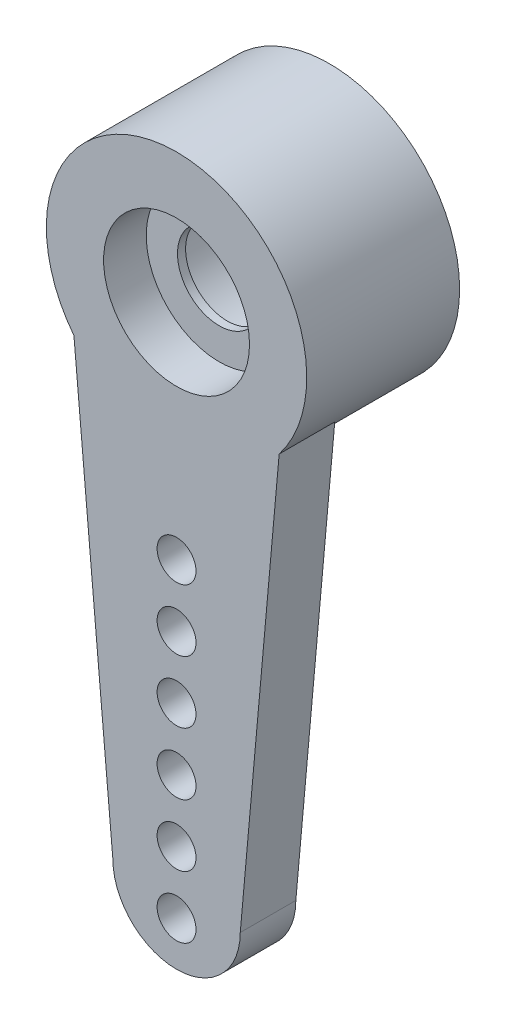
ISO-10303-21;
HEADER;
FILE_DESCRIPTION(('STEP AP214'),'2;1');
FILE_NAME('part.step','',(''),(''),'','','');
FILE_SCHEMA(('AUTOMOTIVE_DESIGN { 1 0 10303 214 1 1 1 1 }'));
ENDSEC;
DATA;
#1=APPLICATION_CONTEXT('core data for automotive mechanical design processes');
#2=APPLICATION_PROTOCOL_DEFINITION('international standard','automotive_design',2000,#1);
#3=PRODUCT_CONTEXT('',#1,'mechanical');
#4=PRODUCT('Part','Part','',(#3));
#5=PRODUCT_RELATED_PRODUCT_CATEGORY('part','',(#4));
#6=PRODUCT_DEFINITION_FORMATION('','',#4);
#7=PRODUCT_DEFINITION_CONTEXT('part definition',#1,'design');
#8=PRODUCT_DEFINITION('design','',#6,#7);
#9=PRODUCT_DEFINITION_SHAPE('','',#8);
#10=(LENGTH_UNIT() NAMED_UNIT(*) SI_UNIT(.MILLI.,.METRE.));
#11=(NAMED_UNIT(*) PLANE_ANGLE_UNIT() SI_UNIT($,.RADIAN.));
#12=(NAMED_UNIT(*) SI_UNIT($,.STERADIAN.) SOLID_ANGLE_UNIT());
#13=UNCERTAINTY_MEASURE_WITH_UNIT(LENGTH_MEASURE(1.E-05),#10,'distance_accuracy_value','');
#14=(GEOMETRIC_REPRESENTATION_CONTEXT(3) GLOBAL_UNCERTAINTY_ASSIGNED_CONTEXT((#13)) GLOBAL_UNIT_ASSIGNED_CONTEXT((#10,
#11,#12)) REPRESENTATION_CONTEXT('',''));
#15=CARTESIAN_POINT('',(0.,0.,0.));
#16=DIRECTION('',(0.,0.,1.));
#17=DIRECTION('',(1.,0.,0.));
#18=AXIS2_PLACEMENT_3D('',#15,#16,#17);
#19=CARTESIAN_POINT('',(-5.49999999999996,-3.00334196949804,-4.25710419796251));
#20=DIRECTION('',(0.,0.,-1.));
#21=DIRECTION('',(-1.,0.,0.));
#22=AXIS2_PLACEMENT_3D('',#19,#20,#21);
#23=CYLINDRICAL_SURFACE('',#22,0.2);
#24=CARTESIAN_POINT('',(-5.49999999999996,-3.00334196949804,-4.67620419796251));
#25=DIRECTION('',(0.,0.,1.));
#26=DIRECTION('',(1.,0.,0.));
#27=AXIS2_PLACEMENT_3D('',#24,#25,#26);
#28=CIRCLE('',#27,0.2);
#29=CARTESIAN_POINT('',(-5.29999999999996,-3.00334196949804,-4.67620419796251));
#30=VERTEX_POINT('',#29);
#31=EDGE_CURVE('E115',#30,#30,#28,.T.);
#32=ORIENTED_EDGE('',*,*,#31,.F.);
#33=EDGE_LOOP('',(#32));
#34=FACE_BOUND('',#33,.T.);
#35=CARTESIAN_POINT('',(-5.49999999999996,-3.00334196949804,-4.39620419796251));
#36=DIRECTION('',(0.,0.,1.));
#37=DIRECTION('',(1.,0.,0.));
#38=AXIS2_PLACEMENT_3D('',#35,#36,#37);
#39=CIRCLE('',#38,0.200000000000001);
#40=CARTESIAN_POINT('',(-5.29999999999996,-3.00334196949804,-4.39620419796251));
#41=VERTEX_POINT('',#40);
#42=EDGE_CURVE('E111',#41,#41,#39,.T.);
#43=ORIENTED_EDGE('',*,*,#42,.T.);
#44=EDGE_LOOP('',(#43));
#45=FACE_BOUND('',#44,.T.);
#46=ADVANCED_FACE('F38',(#34,#45),#23,.F.);
#47=CARTESIAN_POINT('',(-5.49999999999996,-3.00334196949804,-4.25710419796251));
#48=DIRECTION('',(0.,0.,1.));
#49=DIRECTION('',(1.,0.,0.));
#50=AXIS2_PLACEMENT_3D('',#47,#48,#49);
#51=PLANE('',#50);
#52=CARTESIAN_POINT('',(-5.49999999999996,-3.00334196949804,-4.25710419796251));
#53=DIRECTION('',(0.,0.,1.));
#54=DIRECTION('',(1.,0.,0.));
#55=AXIS2_PLACEMENT_3D('',#52,#53,#54);
#56=CIRCLE('',#55,0.35687);
#57=CARTESIAN_POINT('',(-5.21869499999996,-3.22294090819083,-4.25710419796251));
#58=VERTEX_POINT('',#57);
#59=CARTESIAN_POINT('',(-5.78130499999996,-3.22294090819083,-4.25710419796251));
#60=VERTEX_POINT('',#59);
#61=EDGE_CURVE('E46',#58,#60,#56,.T.);
#62=ORIENTED_EDGE('',*,*,#61,.T.);
#63=DIRECTION('',(0.0893287482023586,-0.996002196154506,0.));
#64=VECTOR('',#63,1.);
#65=CARTESIAN_POINT('',(-5.67462499999996,-4.41240696949804,-4.25710419796251));
#66=LINE('',#65,#64);
#67=CARTESIAN_POINT('',(-5.67462499999996,-4.41240696949804,-4.25710419796251));
#68=VERTEX_POINT('',#67);
#69=EDGE_CURVE('E199',#60,#68,#66,.T.);
#70=ORIENTED_EDGE('',*,*,#69,.T.);
#71=CARTESIAN_POINT('',(-5.49999999999996,-4.41240696949804,-4.25710419796251));
#72=DIRECTION('',(0.,0.,1.));
#73=DIRECTION('',(1.,0.,0.));
#74=AXIS2_PLACEMENT_3D('',#71,#72,#73);
#75=CIRCLE('',#74,0.174625);
#76=CARTESIAN_POINT('',(-5.32537499999996,-4.41240696949804,-4.25710419796251));
#77=VERTEX_POINT('',#76);
#78=EDGE_CURVE('E193',#68,#77,#75,.T.);
#79=ORIENTED_EDGE('',*,*,#78,.T.);
#80=DIRECTION('',(0.0893287482023584,0.996002196154506,0.));
#81=VECTOR('',#80,1.);
#82=CARTESIAN_POINT('',(-5.32537499999996,-4.41240696949804,-4.25710419796251));
#83=LINE('',#82,#81);
#84=EDGE_CURVE('E53',#77,#58,#83,.T.);
#85=ORIENTED_EDGE('',*,*,#84,.T.);
#86=EDGE_LOOP('',(#62,#70,#79,#85));
#87=FACE_BOUND('',#86,.T.);
#88=CARTESIAN_POINT('',(-5.49999999999996,-3.00334196949804,-4.25710419796251));
#89=DIRECTION('',(0.,0.,1.));
#90=DIRECTION('',(1.,0.,0.));
#91=AXIS2_PLACEMENT_3D('',#88,#89,#90);
#92=CIRCLE('',#91,0.2);
#93=CARTESIAN_POINT('',(-5.29999999999996,-3.00334196949804,-4.25710419796251));
#94=VERTEX_POINT('',#93);
#95=EDGE_CURVE('E118',#94,#94,#92,.T.);
#96=ORIENTED_EDGE('',*,*,#95,.F.);
#97=EDGE_LOOP('',(#96));
#98=FACE_BOUND('',#97,.T.);
#99=CARTESIAN_POINT('',(-5.49999999999996,-3.61484696949804,-4.25710419796251));
#100=DIRECTION('',(0.,0.,1.));
#101=DIRECTION('',(1.,0.,0.));
#102=AXIS2_PLACEMENT_3D('',#99,#100,#101);
#103=CIRCLE('',#102,0.0533399999999999);
#104=CARTESIAN_POINT('',(-5.44665999999996,-3.61484696949804,-4.25710419796251));
#105=VERTEX_POINT('',#104);
#106=EDGE_CURVE('E168',#105,#105,#103,.T.);
#107=ORIENTED_EDGE('',*,*,#106,.F.);
#108=EDGE_LOOP('',(#107));
#109=FACE_BOUND('',#108,.T.);
#110=CARTESIAN_POINT('',(-5.49999999999996,-3.78502696949804,-4.25710419796251));
#111=DIRECTION('',(0.,0.,1.));
#112=DIRECTION('',(1.,0.,0.));
#113=AXIS2_PLACEMENT_3D('',#110,#111,#112);
#114=CIRCLE('',#113,0.0533399999999999);
#115=CARTESIAN_POINT('',(-5.44665999999996,-3.78502696949804,-4.25710419796251));
#116=VERTEX_POINT('',#115);
#117=EDGE_CURVE('E172',#116,#116,#114,.T.);
#118=ORIENTED_EDGE('',*,*,#117,.F.);
#119=EDGE_LOOP('',(#118));
#120=FACE_BOUND('',#119,.T.);
#121=CARTESIAN_POINT('',(-5.49999999999996,-3.95520696949804,-4.25710419796251));
#122=DIRECTION('',(0.,0.,1.));
#123=DIRECTION('',(1.,0.,0.));
#124=AXIS2_PLACEMENT_3D('',#121,#122,#123);
#125=CIRCLE('',#124,0.05334);
#126=CARTESIAN_POINT('',(-5.44665999999996,-3.95520696949804,-4.25710419796251));
#127=VERTEX_POINT('',#126);
#128=EDGE_CURVE('E176',#127,#127,#125,.T.);
#129=ORIENTED_EDGE('',*,*,#128,.F.);
#130=EDGE_LOOP('',(#129));
#131=FACE_BOUND('',#130,.T.);
#132=CARTESIAN_POINT('',(-5.49999999999996,-4.12538696949804,-4.25710419796251));
#133=DIRECTION('',(0.,0.,1.));
#134=DIRECTION('',(1.,0.,0.));
#135=AXIS2_PLACEMENT_3D('',#132,#133,#134);
#136=CIRCLE('',#135,0.05334);
#137=CARTESIAN_POINT('',(-5.44665999999996,-4.12538696949804,-4.25710419796251));
#138=VERTEX_POINT('',#137);
#139=EDGE_CURVE('E180',#138,#138,#136,.T.);
#140=ORIENTED_EDGE('',*,*,#139,.F.);
#141=EDGE_LOOP('',(#140));
#142=FACE_BOUND('',#141,.T.);
#143=CARTESIAN_POINT('',(-5.49999999999996,-4.29556696949804,-4.25710419796251));
#144=DIRECTION('',(0.,0.,1.));
#145=DIRECTION('',(1.,0.,0.));
#146=AXIS2_PLACEMENT_3D('',#143,#144,#145);
#147=CIRCLE('',#146,0.05334);
#148=CARTESIAN_POINT('',(-5.44665999999996,-4.29556696949804,-4.25710419796251));
#149=VERTEX_POINT('',#148);
#150=EDGE_CURVE('E184',#149,#149,#147,.T.);
#151=ORIENTED_EDGE('',*,*,#150,.F.);
#152=EDGE_LOOP('',(#151));
#153=FACE_BOUND('',#152,.T.);
#154=CARTESIAN_POINT('',(-5.49999999999996,-4.46574696949804,-4.25710419796251));
#155=DIRECTION('',(0.,0.,1.));
#156=DIRECTION('',(1.,0.,0.));
#157=AXIS2_PLACEMENT_3D('',#154,#155,#156);
#158=CIRCLE('',#157,0.05334);
#159=CARTESIAN_POINT('',(-5.44665999999996,-4.46574696949804,-4.25710419796251));
#160=VERTEX_POINT('',#159);
#161=EDGE_CURVE('E187',#160,#160,#158,.T.);
#162=ORIENTED_EDGE('',*,*,#161,.F.);
#163=EDGE_LOOP('',(#162));
#164=FACE_BOUND('',#163,.T.);
#165=ADVANCED_FACE('F130',(#87,#98,#109,#120,#131,#142,#153,#164),#51,.T.);
#166=CARTESIAN_POINT('',(-5.49999999999996,-3.00334196949804,-4.67620419796251));
#167=DIRECTION('',(0.,0.,1.));
#168=DIRECTION('',(1.,0.,0.));
#169=AXIS2_PLACEMENT_3D('',#166,#167,#168);
#170=PLANE('',#169);
#171=CARTESIAN_POINT('',(-5.49999999999996,-3.00334196949804,-4.67620419796251));
#172=DIRECTION('',(0.,0.,1.));
#173=DIRECTION('',(1.,0.,0.));
#174=AXIS2_PLACEMENT_3D('',#171,#172,#173);
#175=CIRCLE('',#174,0.35687);
#176=CARTESIAN_POINT('',(-5.14312999999996,-3.00334196949804,-4.67620419796251));
#177=VERTEX_POINT('',#176);
#178=EDGE_CURVE('E121',#177,#177,#175,.T.);
#179=ORIENTED_EDGE('',*,*,#178,.F.);
#180=EDGE_LOOP('',(#179));
#181=FACE_BOUND('',#180,.T.);
#182=ORIENTED_EDGE('',*,*,#31,.T.);
#183=EDGE_LOOP('',(#182));
#184=FACE_BOUND('',#183,.T.);
#185=ADVANCED_FACE('F127',(#181,#184),#170,.F.);
#186=CARTESIAN_POINT('',(-5.49999999999996,-3.00334196949804,-4.25710419796251));
#187=DIRECTION('',(0.,0.,-1.));
#188=DIRECTION('',(-1.,0.,0.));
#189=AXIS2_PLACEMENT_3D('',#186,#187,#188);
#190=CYLINDRICAL_SURFACE('',#189,0.35687);
#191=CARTESIAN_POINT('',(-5.49999999999996,-3.00334196949804,-4.40950419796251));
#192=DIRECTION('',(0.,0.,-1.));
#193=DIRECTION('',(-1.,0.,0.));
#194=AXIS2_PLACEMENT_3D('',#191,#192,#193);
#195=CIRCLE('',#194,0.35687);
#196=CARTESIAN_POINT('',(-5.21869499999996,-3.22294090819083,-4.40950419796251));
#197=VERTEX_POINT('',#196);
#198=CARTESIAN_POINT('',(-5.78130499999996,-3.22294090819083,-4.40950419796251));
#199=VERTEX_POINT('',#198);
#200=EDGE_CURVE('E88',#197,#199,#195,.T.);
#201=ORIENTED_EDGE('',*,*,#200,.T.);
#202=DIRECTION('',(0.,0.,1.));
#203=VECTOR('',#202,1.);
#204=CARTESIAN_POINT('',(-5.78130499999996,-3.22294090819083,-4.40950419796251));
#205=LINE('',#204,#203);
#206=EDGE_CURVE('E102',#199,#60,#205,.T.);
#207=ORIENTED_EDGE('',*,*,#206,.T.);
#208=ORIENTED_EDGE('',*,*,#61,.F.);
#209=DIRECTION('',(0.,0.,1.));
#210=VECTOR('',#209,1.);
#211=CARTESIAN_POINT('',(-5.21869499999996,-3.22294090819083,-4.40950419796251));
#212=LINE('',#211,#210);
#213=EDGE_CURVE('E97',#197,#58,#212,.T.);
#214=ORIENTED_EDGE('',*,*,#213,.F.);
#215=EDGE_LOOP('',(#201,#207,#208,#214));
#216=FACE_BOUND('',#215,.T.);
#217=ORIENTED_EDGE('',*,*,#178,.T.);
#218=EDGE_LOOP('',(#217));
#219=FACE_BOUND('',#218,.T.);
#220=ADVANCED_FACE('F40',(#216,#219),#190,.T.);
#221=CARTESIAN_POINT('',(-5.49999999999996,-3.00334196949804,-4.37394419796251));
#222=DIRECTION('',(0.,0.,1.));
#223=DIRECTION('',(1.,0.,0.));
#224=AXIS2_PLACEMENT_3D('',#221,#222,#223);
#225=CIRCLE('',#224,0.2);
#226=CARTESIAN_POINT('',(-5.29999999999996,-3.00334196949804,-4.37394419796251));
#227=VERTEX_POINT('',#226);
#228=EDGE_CURVE('E12',#227,#227,#225,.T.);
#229=ORIENTED_EDGE('',*,*,#228,.F.);
#230=EDGE_LOOP('',(#229));
#231=FACE_BOUND('',#230,.T.);
#232=ORIENTED_EDGE('',*,*,#95,.T.);
#233=EDGE_LOOP('',(#232));
#234=FACE_BOUND('',#233,.T.);
#235=ADVANCED_FACE('F136',(#231,#234),#23,.F.);
#236=CARTESIAN_POINT('',(-5.49999999999996,-3.00334196949804,-4.39620419796251));
#237=DIRECTION('',(0.,0.,1.));
#238=DIRECTION('',(1.,0.,0.));
#239=AXIS2_PLACEMENT_3D('',#236,#237,#238);
#240=PLANE('',#239);
#241=ORIENTED_EDGE('',*,*,#42,.F.);
#242=EDGE_LOOP('',(#241));
#243=FACE_BOUND('',#242,.T.);
#244=CARTESIAN_POINT('',(-5.49999999999996,-3.00334196949804,-4.39620419796251));
#245=DIRECTION('',(0.,0.,1.));
#246=DIRECTION('',(1.,0.,0.));
#247=AXIS2_PLACEMENT_3D('',#244,#245,#246);
#248=CIRCLE('',#247,0.114300000000001);
#249=CARTESIAN_POINT('',(-5.38569999999996,-3.00334196949804,-4.39620419796251));
#250=VERTEX_POINT('',#249);
#251=EDGE_CURVE('E108',#250,#250,#248,.T.);
#252=ORIENTED_EDGE('',*,*,#251,.T.);
#253=EDGE_LOOP('',(#252));
#254=FACE_BOUND('',#253,.T.);
#255=ADVANCED_FACE('F139',(#243,#254),#240,.F.);
#256=CARTESIAN_POINT('',(-5.49999999999996,-3.00334196949804,-3.69141877301327));
#257=DIRECTION('',(0.,0.,-1.));
#258=DIRECTION('',(-1.,0.,0.));
#259=AXIS2_PLACEMENT_3D('',#256,#257,#258);
#260=CYLINDRICAL_SURFACE('',#259,0.114300000000001);
#261=ORIENTED_EDGE('',*,*,#251,.F.);
#262=EDGE_LOOP('',(#261));
#263=FACE_BOUND('',#262,.T.);
#264=CARTESIAN_POINT('',(-5.49999999999996,-3.00334196949804,-4.37394419796251));
#265=DIRECTION('',(0.,0.,1.));
#266=DIRECTION('',(1.,0.,0.));
#267=AXIS2_PLACEMENT_3D('',#264,#265,#266);
#268=CIRCLE('',#267,0.114300000000001);
#269=CARTESIAN_POINT('',(-5.38569999999996,-3.00334196949804,-4.37394419796251));
#270=VERTEX_POINT('',#269);
#271=EDGE_CURVE('E112',#270,#270,#268,.T.);
#272=ORIENTED_EDGE('',*,*,#271,.T.);
#273=EDGE_LOOP('',(#272));
#274=FACE_BOUND('',#273,.T.);
#275=ADVANCED_FACE('F142',(#263,#274),#260,.F.);
#276=CARTESIAN_POINT('',(-5.49999999999996,-3.00334196949804,-4.37394419796251));
#277=DIRECTION('',(0.,0.,1.));
#278=DIRECTION('',(1.,0.,0.));
#279=AXIS2_PLACEMENT_3D('',#276,#277,#278);
#280=PLANE('',#279);
#281=ORIENTED_EDGE('',*,*,#271,.F.);
#282=EDGE_LOOP('',(#281));
#283=FACE_BOUND('',#282,.T.);
#284=ORIENTED_EDGE('',*,*,#228,.T.);
#285=EDGE_LOOP('',(#284));
#286=FACE_BOUND('',#285,.T.);
#287=ADVANCED_FACE('F148',(#283,#286),#280,.T.);
#288=CARTESIAN_POINT('',(-5.49999999999996,-4.41240696949804,-4.40950419796251));
#289=DIRECTION('',(0.,0.,1.));
#290=DIRECTION('',(1.,0.,0.));
#291=AXIS2_PLACEMENT_3D('',#288,#289,#290);
#292=CYLINDRICAL_SURFACE('',#291,0.174625);
#293=ORIENTED_EDGE('',*,*,#78,.F.);
#294=DIRECTION('',(0.,0.,1.));
#295=VECTOR('',#294,1.);
#296=CARTESIAN_POINT('',(-5.67462499999996,-4.41240696949804,-4.40950419796251));
#297=LINE('',#296,#295);
#298=CARTESIAN_POINT('',(-5.67462499999996,-4.41240696949804,-4.40950419796251));
#299=VERTEX_POINT('',#298);
#300=EDGE_CURVE('E62',#299,#68,#297,.T.);
#301=ORIENTED_EDGE('',*,*,#300,.F.);
#302=CARTESIAN_POINT('',(-5.49999999999996,-4.41240696949804,-4.40950419796251));
#303=DIRECTION('',(0.,0.,1.));
#304=DIRECTION('',(1.,0.,0.));
#305=AXIS2_PLACEMENT_3D('',#302,#303,#304);
#306=CIRCLE('',#305,0.174625);
#307=CARTESIAN_POINT('',(-5.32537499999996,-4.41240696949804,-4.40950419796251));
#308=VERTEX_POINT('',#307);
#309=EDGE_CURVE('E99',#299,#308,#306,.T.);
#310=ORIENTED_EDGE('',*,*,#309,.T.);
#311=DIRECTION('',(0.,0.,1.));
#312=VECTOR('',#311,1.);
#313=CARTESIAN_POINT('',(-5.32537499999996,-4.41240696949804,-4.40950419796251));
#314=LINE('',#313,#312);
#315=EDGE_CURVE('E82',#308,#77,#314,.T.);
#316=ORIENTED_EDGE('',*,*,#315,.T.);
#317=EDGE_LOOP('',(#293,#301,#310,#316));
#318=FACE_BOUND('',#317,.T.);
#319=ADVANCED_FACE('F154',(#318),#292,.T.);
#320=CARTESIAN_POINT('',(-5.67462499999996,-4.41240696949804,-4.40950419796251));
#321=DIRECTION('',(-0.996002196154506,-0.0893287482023586,0.));
#322=DIRECTION('',(0.0893287482023586,-0.996002196154506,0.));
#323=AXIS2_PLACEMENT_3D('',#320,#321,#322);
#324=PLANE('',#323);
#325=ORIENTED_EDGE('',*,*,#69,.F.);
#326=ORIENTED_EDGE('',*,*,#206,.F.);
#327=DIRECTION('',(0.0893287482023586,-0.996002196154506,0.));
#328=VECTOR('',#327,1.);
#329=CARTESIAN_POINT('',(-5.67462499999996,-4.41240696949804,-4.40950419796251));
#330=LINE('',#329,#328);
#331=EDGE_CURVE('E91',#199,#299,#330,.T.);
#332=ORIENTED_EDGE('',*,*,#331,.T.);
#333=ORIENTED_EDGE('',*,*,#300,.T.);
#334=EDGE_LOOP('',(#325,#326,#332,#333));
#335=FACE_BOUND('',#334,.T.);
#336=ADVANCED_FACE('F205',(#335),#324,.T.);
#337=CARTESIAN_POINT('',(-5.32537499999996,-4.41240696949804,-4.40950419796251));
#338=DIRECTION('',(0.996002196154506,-0.0893287482023584,0.));
#339=DIRECTION('',(0.0893287482023584,0.996002196154506,0.));
#340=AXIS2_PLACEMENT_3D('',#337,#338,#339);
#341=PLANE('',#340);
#342=ORIENTED_EDGE('',*,*,#84,.F.);
#343=ORIENTED_EDGE('',*,*,#315,.F.);
#344=DIRECTION('',(0.0893287482023584,0.996002196154506,0.));
#345=VECTOR('',#344,1.);
#346=CARTESIAN_POINT('',(-5.32537499999996,-4.41240696949804,-4.40950419796251));
#347=LINE('',#346,#345);
#348=EDGE_CURVE('E90',#308,#197,#347,.T.);
#349=ORIENTED_EDGE('',*,*,#348,.T.);
#350=ORIENTED_EDGE('',*,*,#213,.T.);
#351=EDGE_LOOP('',(#342,#343,#349,#350));
#352=FACE_BOUND('',#351,.T.);
#353=ADVANCED_FACE('F96',(#352),#341,.T.);
#354=CARTESIAN_POINT('',(-5.49999999999996,-4.41240696949804,-4.40950419796251));
#355=DIRECTION('',(0.,0.,1.));
#356=DIRECTION('',(1.,0.,0.));
#357=AXIS2_PLACEMENT_3D('',#354,#355,#356);
#358=PLANE('',#357);
#359=CARTESIAN_POINT('',(-5.49999999999996,-3.61484696949804,-4.40950419796251));
#360=DIRECTION('',(0.,0.,1.));
#361=DIRECTION('',(1.,0.,0.));
#362=AXIS2_PLACEMENT_3D('',#359,#360,#361);
#363=CIRCLE('',#362,0.0533399999999999);
#364=CARTESIAN_POINT('',(-5.44665999999996,-3.61484696949804,-4.40950419796251));
#365=VERTEX_POINT('',#364);
#366=EDGE_CURVE('E246',#365,#365,#363,.T.);
#367=ORIENTED_EDGE('',*,*,#366,.T.);
#368=EDGE_LOOP('',(#367));
#369=FACE_BOUND('',#368,.T.);
#370=CARTESIAN_POINT('',(-5.49999999999996,-3.78502696949804,-4.40950419796251));
#371=DIRECTION('',(0.,0.,1.));
#372=DIRECTION('',(1.,0.,0.));
#373=AXIS2_PLACEMENT_3D('',#370,#371,#372);
#374=CIRCLE('',#373,0.0533399999999999);
#375=CARTESIAN_POINT('',(-5.44665999999996,-3.78502696949804,-4.40950419796251));
#376=VERTEX_POINT('',#375);
#377=EDGE_CURVE('E250',#376,#376,#374,.T.);
#378=ORIENTED_EDGE('',*,*,#377,.T.);
#379=EDGE_LOOP('',(#378));
#380=FACE_BOUND('',#379,.T.);
#381=CARTESIAN_POINT('',(-5.49999999999996,-3.95520696949804,-4.40950419796251));
#382=DIRECTION('',(0.,0.,1.));
#383=DIRECTION('',(1.,0.,0.));
#384=AXIS2_PLACEMENT_3D('',#381,#382,#383);
#385=CIRCLE('',#384,0.05334);
#386=CARTESIAN_POINT('',(-5.44665999999996,-3.95520696949804,-4.40950419796251));
#387=VERTEX_POINT('',#386);
#388=EDGE_CURVE('E254',#387,#387,#385,.T.);
#389=ORIENTED_EDGE('',*,*,#388,.T.);
#390=EDGE_LOOP('',(#389));
#391=FACE_BOUND('',#390,.T.);
#392=CARTESIAN_POINT('',(-5.49999999999996,-4.12538696949804,-4.40950419796251));
#393=DIRECTION('',(0.,0.,1.));
#394=DIRECTION('',(1.,0.,0.));
#395=AXIS2_PLACEMENT_3D('',#392,#393,#394);
#396=CIRCLE('',#395,0.05334);
#397=CARTESIAN_POINT('',(-5.44665999999996,-4.12538696949804,-4.40950419796251));
#398=VERTEX_POINT('',#397);
#399=EDGE_CURVE('E258',#398,#398,#396,.T.);
#400=ORIENTED_EDGE('',*,*,#399,.T.);
#401=EDGE_LOOP('',(#400));
#402=FACE_BOUND('',#401,.T.);
#403=CARTESIAN_POINT('',(-5.49999999999996,-4.29556696949804,-4.40950419796251));
#404=DIRECTION('',(0.,0.,1.));
#405=DIRECTION('',(1.,0.,0.));
#406=AXIS2_PLACEMENT_3D('',#403,#404,#405);
#407=CIRCLE('',#406,0.05334);
#408=CARTESIAN_POINT('',(-5.44665999999996,-4.29556696949804,-4.40950419796251));
#409=VERTEX_POINT('',#408);
#410=EDGE_CURVE('E190',#409,#409,#407,.T.);
#411=ORIENTED_EDGE('',*,*,#410,.T.);
#412=EDGE_LOOP('',(#411));
#413=FACE_BOUND('',#412,.T.);
#414=CARTESIAN_POINT('',(-5.49999999999996,-4.46574696949804,-4.40950419796251));
#415=DIRECTION('',(0.,0.,1.));
#416=DIRECTION('',(1.,0.,0.));
#417=AXIS2_PLACEMENT_3D('',#414,#415,#416);
#418=CIRCLE('',#417,0.05334);
#419=CARTESIAN_POINT('',(-5.44665999999996,-4.46574696949804,-4.40950419796251));
#420=VERTEX_POINT('',#419);
#421=EDGE_CURVE('E189',#420,#420,#418,.T.);
#422=ORIENTED_EDGE('',*,*,#421,.T.);
#423=EDGE_LOOP('',(#422));
#424=FACE_BOUND('',#423,.T.);
#425=ORIENTED_EDGE('',*,*,#309,.F.);
#426=ORIENTED_EDGE('',*,*,#331,.F.);
#427=ORIENTED_EDGE('',*,*,#200,.F.);
#428=ORIENTED_EDGE('',*,*,#348,.F.);
#429=EDGE_LOOP('',(#425,#426,#427,#428));
#430=FACE_BOUND('',#429,.T.);
#431=ADVANCED_FACE('F89',(#369,#380,#391,#402,#413,#424,#430),#358,.F.);
#432=CARTESIAN_POINT('',(-5.49999999999996,-4.46574696949804,-4.40950419796251));
#433=DIRECTION('',(0.,0.,1.));
#434=DIRECTION('',(1.,0.,0.));
#435=AXIS2_PLACEMENT_3D('',#432,#433,#434);
#436=CYLINDRICAL_SURFACE('',#435,0.05334);
#437=ORIENTED_EDGE('',*,*,#421,.F.);
#438=EDGE_LOOP('',(#437));
#439=FACE_BOUND('',#438,.T.);
#440=ORIENTED_EDGE('',*,*,#161,.T.);
#441=EDGE_LOOP('',(#440));
#442=FACE_BOUND('',#441,.T.);
#443=ADVANCED_FACE('F217',(#439,#442),#436,.F.);
#444=CARTESIAN_POINT('',(-5.49999999999996,-4.29556696949804,-4.40950419796251));
#445=DIRECTION('',(0.,0.,1.));
#446=DIRECTION('',(1.,0.,0.));
#447=AXIS2_PLACEMENT_3D('',#444,#445,#446);
#448=CYLINDRICAL_SURFACE('',#447,0.05334);
#449=ORIENTED_EDGE('',*,*,#410,.F.);
#450=EDGE_LOOP('',(#449));
#451=FACE_BOUND('',#450,.T.);
#452=ORIENTED_EDGE('',*,*,#150,.T.);
#453=EDGE_LOOP('',(#452));
#454=FACE_BOUND('',#453,.T.);
#455=ADVANCED_FACE('F221',(#451,#454),#448,.F.);
#456=CARTESIAN_POINT('',(-5.49999999999996,-4.12538696949804,-4.40950419796251));
#457=DIRECTION('',(0.,0.,1.));
#458=DIRECTION('',(1.,0.,0.));
#459=AXIS2_PLACEMENT_3D('',#456,#457,#458);
#460=CYLINDRICAL_SURFACE('',#459,0.05334);
#461=ORIENTED_EDGE('',*,*,#399,.F.);
#462=EDGE_LOOP('',(#461));
#463=FACE_BOUND('',#462,.T.);
#464=ORIENTED_EDGE('',*,*,#139,.T.);
#465=EDGE_LOOP('',(#464));
#466=FACE_BOUND('',#465,.T.);
#467=ADVANCED_FACE('F225',(#463,#466),#460,.F.);
#468=CARTESIAN_POINT('',(-5.49999999999996,-3.95520696949804,-4.40950419796251));
#469=DIRECTION('',(0.,0.,1.));
#470=DIRECTION('',(1.,0.,0.));
#471=AXIS2_PLACEMENT_3D('',#468,#469,#470);
#472=CYLINDRICAL_SURFACE('',#471,0.05334);
#473=ORIENTED_EDGE('',*,*,#388,.F.);
#474=EDGE_LOOP('',(#473));
#475=FACE_BOUND('',#474,.T.);
#476=ORIENTED_EDGE('',*,*,#128,.T.);
#477=EDGE_LOOP('',(#476));
#478=FACE_BOUND('',#477,.T.);
#479=ADVANCED_FACE('F229',(#475,#478),#472,.F.);
#480=CARTESIAN_POINT('',(-5.49999999999996,-3.78502696949804,-4.40950419796251));
#481=DIRECTION('',(0.,0.,1.));
#482=DIRECTION('',(1.,0.,0.));
#483=AXIS2_PLACEMENT_3D('',#480,#481,#482);
#484=CYLINDRICAL_SURFACE('',#483,0.0533399999999999);
#485=ORIENTED_EDGE('',*,*,#377,.F.);
#486=EDGE_LOOP('',(#485));
#487=FACE_BOUND('',#486,.T.);
#488=ORIENTED_EDGE('',*,*,#117,.T.);
#489=EDGE_LOOP('',(#488));
#490=FACE_BOUND('',#489,.T.);
#491=ADVANCED_FACE('F233',(#487,#490),#484,.F.);
#492=CARTESIAN_POINT('',(-5.49999999999996,-3.61484696949804,-4.40950419796251));
#493=DIRECTION('',(0.,0.,1.));
#494=DIRECTION('',(1.,0.,0.));
#495=AXIS2_PLACEMENT_3D('',#492,#493,#494);
#496=CYLINDRICAL_SURFACE('',#495,0.0533399999999999);
#497=ORIENTED_EDGE('',*,*,#366,.F.);
#498=EDGE_LOOP('',(#497));
#499=FACE_BOUND('',#498,.T.);
#500=ORIENTED_EDGE('',*,*,#106,.T.);
#501=EDGE_LOOP('',(#500));
#502=FACE_BOUND('',#501,.T.);
#503=ADVANCED_FACE('F237',(#499,#502),#496,.F.);
#504=CLOSED_SHELL('',(#46,#165,#185,#220,#235,#255,#275,#287,#319,#336,#353,#431,#443,#455,#467,
#479,#491,#503));
#505=MANIFOLD_SOLID_BREP('B2',#504);
#506=ADVANCED_BREP_SHAPE_REPRESENTATION('',(#18,#505),#14);
#507=SHAPE_DEFINITION_REPRESENTATION(#9,#506);
ENDSEC;
END-ISO-10303-21;
